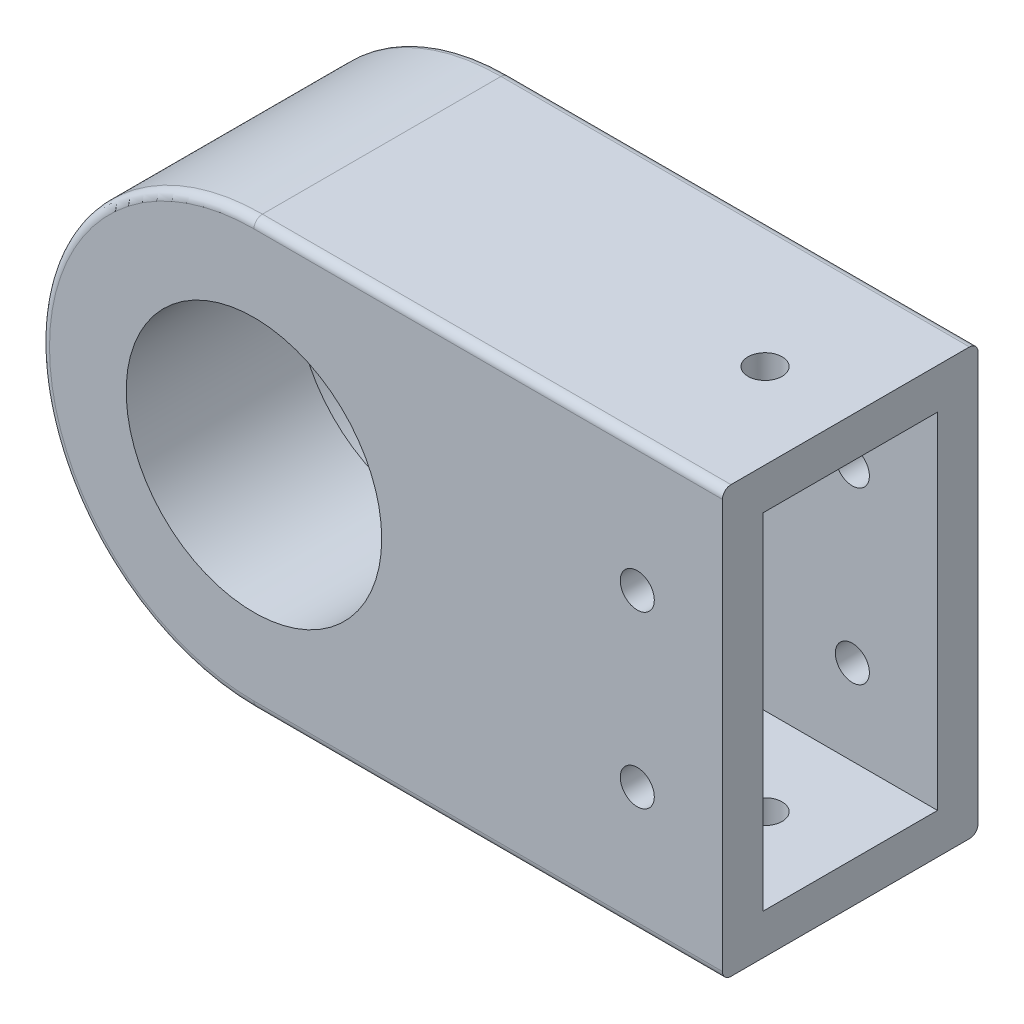
ISO-10303-21;
HEADER;
FILE_DESCRIPTION(('STEP AP214'),'2;1');
FILE_NAME('part.step','',(''),(''),'','','');
FILE_SCHEMA(('AUTOMOTIVE_DESIGN { 1 0 10303 214 1 1 1 1 }'));
ENDSEC;
DATA;
#1=APPLICATION_CONTEXT('core data for automotive mechanical design processes');
#2=APPLICATION_PROTOCOL_DEFINITION('international standard','automotive_design',2000,#1);
#3=PRODUCT_CONTEXT('',#1,'mechanical');
#4=PRODUCT('Part','Part','',(#3));
#5=PRODUCT_RELATED_PRODUCT_CATEGORY('part','',(#4));
#6=PRODUCT_DEFINITION_FORMATION('','',#4);
#7=PRODUCT_DEFINITION_CONTEXT('part definition',#1,'design');
#8=PRODUCT_DEFINITION('design','',#6,#7);
#9=PRODUCT_DEFINITION_SHAPE('','',#8);
#10=(LENGTH_UNIT() NAMED_UNIT(*) SI_UNIT(.MILLI.,.METRE.));
#11=(NAMED_UNIT(*) PLANE_ANGLE_UNIT() SI_UNIT($,.RADIAN.));
#12=(NAMED_UNIT(*) SI_UNIT($,.STERADIAN.) SOLID_ANGLE_UNIT());
#13=UNCERTAINTY_MEASURE_WITH_UNIT(LENGTH_MEASURE(1.E-05),#10,'distance_accuracy_value','');
#14=(GEOMETRIC_REPRESENTATION_CONTEXT(3) GLOBAL_UNCERTAINTY_ASSIGNED_CONTEXT((#13)) GLOBAL_UNIT_ASSIGNED_CONTEXT((#10,
#11,#12)) REPRESENTATION_CONTEXT('',''));
#15=CARTESIAN_POINT('',(0.,0.,0.));
#16=DIRECTION('',(0.,0.,1.));
#17=DIRECTION('',(1.,0.,0.));
#18=AXIS2_PLACEMENT_3D('',#15,#16,#17);
#19=CARTESIAN_POINT('',(0.,0.,5.));
#20=DIRECTION('',(0.,0.,1.));
#21=DIRECTION('',(1.,0.,0.));
#22=AXIS2_PLACEMENT_3D('',#19,#20,#21);
#23=CYLINDRICAL_SURFACE('',#22,19.25);
#24=CARTESIAN_POINT('',(0.,0.,5.));
#25=DIRECTION('',(0.,0.,1.));
#26=DIRECTION('',(1.,0.,0.));
#27=AXIS2_PLACEMENT_3D('',#24,#25,#26);
#28=CIRCLE('',#27,19.25);
#29=CARTESIAN_POINT('',(19.25,0.,5.));
#30=VERTEX_POINT('',#29);
#31=EDGE_CURVE('E141',#30,#30,#28,.T.);
#32=ORIENTED_EDGE('',*,*,#31,.F.);
#33=EDGE_LOOP('',(#32));
#34=FACE_BOUND('',#33,.T.);
#35=CARTESIAN_POINT('',(0.,0.,10.));
#36=DIRECTION('',(0.,0.,1.));
#37=DIRECTION('',(1.,0.,0.));
#38=AXIS2_PLACEMENT_3D('',#35,#36,#37);
#39=CIRCLE('',#38,19.25);
#40=CARTESIAN_POINT('',(19.25,0.,10.));
#41=VERTEX_POINT('',#40);
#42=EDGE_CURVE('E11',#41,#41,#39,.F.);
#43=ORIENTED_EDGE('',*,*,#42,.F.);
#44=EDGE_LOOP('',(#43));
#45=FACE_BOUND('',#44,.T.);
#46=ADVANCED_FACE('F31',(#34,#45),#23,.F.);
#47=CARTESIAN_POINT('',(70.,-25.,30.));
#48=DIRECTION('',(0.,1.,0.));
#49=DIRECTION('',(0.,0.,1.));
#50=AXIS2_PLACEMENT_3D('',#47,#48,#49);
#51=PLANE('',#50);
#52=DIRECTION('',(0.,0.,-1.));
#53=VECTOR('',#52,1.);
#54=CARTESIAN_POINT('',(55.,-25.,0.));
#55=LINE('',#54,#53);
#56=CARTESIAN_POINT('',(55.,-25.,29.));
#57=VERTEX_POINT('',#56);
#58=CARTESIAN_POINT('',(55.,-25.,1.));
#59=VERTEX_POINT('',#58);
#60=EDGE_CURVE('E239',#57,#59,#55,.T.);
#61=ORIENTED_EDGE('',*,*,#60,.F.);
#62=DIRECTION('',(1.,0.,0.));
#63=VECTOR('',#62,1.);
#64=CARTESIAN_POINT('',(0.,-25.,29.));
#65=LINE('',#64,#63);
#66=CARTESIAN_POINT('',(0.,-25.,29.));
#67=VERTEX_POINT('',#66);
#68=EDGE_CURVE('E39',#57,#67,#65,.F.);
#69=ORIENTED_EDGE('',*,*,#68,.T.);
#70=DIRECTION('',(0.,0.,-1.));
#71=VECTOR('',#70,1.);
#72=CARTESIAN_POINT('',(0.,-25.,30.));
#73=LINE('',#72,#71);
#74=CARTESIAN_POINT('',(0.,-25.,1.));
#75=VERTEX_POINT('',#74);
#76=EDGE_CURVE('E131',#67,#75,#73,.T.);
#77=ORIENTED_EDGE('',*,*,#76,.T.);
#78=DIRECTION('',(1.,0.,0.));
#79=VECTOR('',#78,1.);
#80=CARTESIAN_POINT('',(70.,-25.,1.));
#81=LINE('',#80,#79);
#82=EDGE_CURVE('E205',#75,#59,#81,.T.);
#83=ORIENTED_EDGE('',*,*,#82,.T.);
#84=EDGE_LOOP('',(#61,#69,#77,#83));
#85=FACE_BOUND('',#84,.T.);
#86=CARTESIAN_POINT('',(45.,-25.,15.));
#87=DIRECTION('',(0.,1.,0.));
#88=DIRECTION('',(0.,0.,1.));
#89=AXIS2_PLACEMENT_3D('',#86,#87,#88);
#90=CIRCLE('',#89,2.);
#91=CARTESIAN_POINT('',(45.,-25.,17.));
#92=VERTEX_POINT('',#91);
#93=EDGE_CURVE('E173',#92,#92,#90,.F.);
#94=ORIENTED_EDGE('',*,*,#93,.F.);
#95=EDGE_LOOP('',(#94));
#96=FACE_BOUND('',#95,.T.);
#97=ADVANCED_FACE('F278',(#85,#96),#51,.F.);
#98=CARTESIAN_POINT('',(0.,25.,30.));
#99=DIRECTION('',(0.,-1.,0.));
#100=DIRECTION('',(0.,0.,-1.));
#101=AXIS2_PLACEMENT_3D('',#98,#99,#100);
#102=PLANE('',#101);
#103=DIRECTION('',(0.,0.,1.));
#104=VECTOR('',#103,1.);
#105=CARTESIAN_POINT('',(55.,25.,30.));
#106=LINE('',#105,#104);
#107=CARTESIAN_POINT('',(55.,25.,1.));
#108=VERTEX_POINT('',#107);
#109=CARTESIAN_POINT('',(55.,25.,29.));
#110=VERTEX_POINT('',#109);
#111=EDGE_CURVE('E229',#108,#110,#106,.T.);
#112=ORIENTED_EDGE('',*,*,#111,.F.);
#113=DIRECTION('',(-1.,0.,0.));
#114=VECTOR('',#113,1.);
#115=CARTESIAN_POINT('',(0.,25.,1.));
#116=LINE('',#115,#114);
#117=CARTESIAN_POINT('',(0.,25.,1.));
#118=VERTEX_POINT('',#117);
#119=EDGE_CURVE('E180',#108,#118,#116,.T.);
#120=ORIENTED_EDGE('',*,*,#119,.T.);
#121=DIRECTION('',(0.,0.,-1.));
#122=VECTOR('',#121,1.);
#123=CARTESIAN_POINT('',(0.,25.,30.));
#124=LINE('',#123,#122);
#125=CARTESIAN_POINT('',(0.,25.,29.));
#126=VERTEX_POINT('',#125);
#127=EDGE_CURVE('E159',#126,#118,#124,.T.);
#128=ORIENTED_EDGE('',*,*,#127,.F.);
#129=DIRECTION('',(-1.,0.,0.));
#130=VECTOR('',#129,1.);
#131=CARTESIAN_POINT('',(55.,25.,29.));
#132=LINE('',#131,#130);
#133=EDGE_CURVE('E130',#126,#110,#132,.F.);
#134=ORIENTED_EDGE('',*,*,#133,.T.);
#135=EDGE_LOOP('',(#112,#120,#128,#134));
#136=FACE_BOUND('',#135,.T.);
#137=CARTESIAN_POINT('',(45.,25.,15.));
#138=DIRECTION('',(0.,-1.,0.));
#139=DIRECTION('',(0.,0.,-1.));
#140=AXIS2_PLACEMENT_3D('',#137,#138,#139);
#141=CIRCLE('',#140,2.);
#142=CARTESIAN_POINT('',(45.,25.,13.));
#143=VERTEX_POINT('',#142);
#144=EDGE_CURVE('E370',#143,#143,#141,.F.);
#145=ORIENTED_EDGE('',*,*,#144,.F.);
#146=EDGE_LOOP('',(#145));
#147=FACE_BOUND('',#146,.T.);
#148=ADVANCED_FACE('F227',(#136,#147),#102,.F.);
#149=CARTESIAN_POINT('',(20.,20.25,25.25));
#150=DIRECTION('',(0.,1.,0.));
#151=DIRECTION('',(0.,0.,1.));
#152=AXIS2_PLACEMENT_3D('',#149,#150,#151);
#153=PLANE('',#152);
#154=DIRECTION('',(1.,0.,0.));
#155=VECTOR('',#154,1.);
#156=CARTESIAN_POINT('',(20.,20.25,4.75000000000001));
#157=LINE('',#156,#155);
#158=CARTESIAN_POINT('',(20.,20.25,4.75000000000001));
#159=VERTEX_POINT('',#158);
#160=CARTESIAN_POINT('',(55.,20.25,4.75000000000001));
#161=VERTEX_POINT('',#160);
#162=EDGE_CURVE('E138',#159,#161,#157,.T.);
#163=ORIENTED_EDGE('',*,*,#162,.T.);
#164=DIRECTION('',(0.,0.,1.));
#165=VECTOR('',#164,1.);
#166=CARTESIAN_POINT('',(55.,20.25,25.25));
#167=LINE('',#166,#165);
#168=CARTESIAN_POINT('',(55.,20.25,25.25));
#169=VERTEX_POINT('',#168);
#170=EDGE_CURVE('E120',#161,#169,#167,.T.);
#171=ORIENTED_EDGE('',*,*,#170,.T.);
#172=DIRECTION('',(1.,0.,0.));
#173=VECTOR('',#172,1.);
#174=CARTESIAN_POINT('',(20.,20.25,25.25));
#175=LINE('',#174,#173);
#176=CARTESIAN_POINT('',(20.,20.25,25.25));
#177=VERTEX_POINT('',#176);
#178=EDGE_CURVE('E149',#177,#169,#175,.T.);
#179=ORIENTED_EDGE('',*,*,#178,.F.);
#180=DIRECTION('',(0.,0.,1.));
#181=VECTOR('',#180,1.);
#182=CARTESIAN_POINT('',(20.,20.25,25.25));
#183=LINE('',#182,#181);
#184=EDGE_CURVE('E147',#159,#177,#183,.T.);
#185=ORIENTED_EDGE('',*,*,#184,.F.);
#186=EDGE_LOOP('',(#163,#171,#179,#185));
#187=FACE_BOUND('',#186,.T.);
#188=CARTESIAN_POINT('',(45.,20.25,15.));
#189=DIRECTION('',(0.,1.,0.));
#190=DIRECTION('',(0.,0.,1.));
#191=AXIS2_PLACEMENT_3D('',#188,#189,#190);
#192=CIRCLE('',#191,2.);
#193=CARTESIAN_POINT('',(45.,20.25,17.));
#194=VERTEX_POINT('',#193);
#195=EDGE_CURVE('E177',#194,#194,#192,.F.);
#196=ORIENTED_EDGE('',*,*,#195,.F.);
#197=EDGE_LOOP('',(#196));
#198=FACE_BOUND('',#197,.T.);
#199=ADVANCED_FACE('F144',(#187,#198),#153,.F.);
#200=CARTESIAN_POINT('',(20.,-20.25,25.25));
#201=DIRECTION('',(0.,-1.,0.));
#202=DIRECTION('',(0.,0.,-1.));
#203=AXIS2_PLACEMENT_3D('',#200,#201,#202);
#204=PLANE('',#203);
#205=DIRECTION('',(1.,0.,0.));
#206=VECTOR('',#205,1.);
#207=CARTESIAN_POINT('',(20.,-20.25,25.25));
#208=LINE('',#207,#206);
#209=CARTESIAN_POINT('',(20.,-20.25,25.25));
#210=VERTEX_POINT('',#209);
#211=CARTESIAN_POINT('',(55.,-20.25,25.25));
#212=VERTEX_POINT('',#211);
#213=EDGE_CURVE('E152',#210,#212,#208,.T.);
#214=ORIENTED_EDGE('',*,*,#213,.T.);
#215=DIRECTION('',(0.,0.,-1.));
#216=VECTOR('',#215,1.);
#217=CARTESIAN_POINT('',(55.,-20.25,25.25));
#218=LINE('',#217,#216);
#219=CARTESIAN_POINT('',(55.,-20.25,4.75000000000001));
#220=VERTEX_POINT('',#219);
#221=EDGE_CURVE('E142',#212,#220,#218,.T.);
#222=ORIENTED_EDGE('',*,*,#221,.T.);
#223=DIRECTION('',(1.,0.,0.));
#224=VECTOR('',#223,1.);
#225=CARTESIAN_POINT('',(20.,-20.25,4.75000000000001));
#226=LINE('',#225,#224);
#227=CARTESIAN_POINT('',(20.,-20.25,4.75000000000001));
#228=VERTEX_POINT('',#227);
#229=EDGE_CURVE('E140',#228,#220,#226,.T.);
#230=ORIENTED_EDGE('',*,*,#229,.F.);
#231=DIRECTION('',(0.,0.,-1.));
#232=VECTOR('',#231,1.);
#233=CARTESIAN_POINT('',(20.,-20.25,25.25));
#234=LINE('',#233,#232);
#235=EDGE_CURVE('E150',#210,#228,#234,.T.);
#236=ORIENTED_EDGE('',*,*,#235,.F.);
#237=EDGE_LOOP('',(#214,#222,#230,#236));
#238=FACE_BOUND('',#237,.T.);
#239=CARTESIAN_POINT('',(45.,-20.25,15.));
#240=DIRECTION('',(0.,-1.,0.));
#241=DIRECTION('',(0.,0.,-1.));
#242=AXIS2_PLACEMENT_3D('',#239,#240,#241);
#243=CIRCLE('',#242,2.);
#244=CARTESIAN_POINT('',(45.,-20.25,13.));
#245=VERTEX_POINT('',#244);
#246=EDGE_CURVE('E174',#245,#245,#243,.F.);
#247=ORIENTED_EDGE('',*,*,#246,.F.);
#248=EDGE_LOOP('',(#247));
#249=FACE_BOUND('',#248,.T.);
#250=ADVANCED_FACE('F255',(#238,#249),#204,.F.);
#251=CARTESIAN_POINT('',(0.,0.,30.));
#252=DIRECTION('',(0.,0.,1.));
#253=DIRECTION('',(1.,0.,0.));
#254=AXIS2_PLACEMENT_3D('',#251,#252,#253);
#255=PLANE('',#254);
#256=CARTESIAN_POINT('',(45.,-10.25,30.));
#257=DIRECTION('',(0.,0.,1.));
#258=DIRECTION('',(1.,0.,0.));
#259=AXIS2_PLACEMENT_3D('',#256,#257,#258);
#260=CIRCLE('',#259,2.);
#261=CARTESIAN_POINT('',(47.,-10.25,30.));
#262=VERTEX_POINT('',#261);
#263=EDGE_CURVE('E387',#262,#262,#260,.F.);
#264=ORIENTED_EDGE('',*,*,#263,.T.);
#265=EDGE_LOOP('',(#264));
#266=FACE_BOUND('',#265,.T.);
#267=CARTESIAN_POINT('',(0.,0.,30.));
#268=DIRECTION('',(0.,0.,1.));
#269=DIRECTION('',(1.,0.,0.));
#270=AXIS2_PLACEMENT_3D('',#267,#268,#269);
#271=CIRCLE('',#270,24.);
#272=CARTESIAN_POINT('',(0.,24.,30.));
#273=VERTEX_POINT('',#272);
#274=CARTESIAN_POINT('',(0.,-24.,30.));
#275=VERTEX_POINT('',#274);
#276=EDGE_CURVE('E46',#273,#275,#271,.T.);
#277=ORIENTED_EDGE('',*,*,#276,.T.);
#278=DIRECTION('',(1.,0.,0.));
#279=VECTOR('',#278,1.);
#280=CARTESIAN_POINT('',(55.,-24.,30.));
#281=LINE('',#280,#279);
#282=CARTESIAN_POINT('',(55.,-24.,30.));
#283=VERTEX_POINT('',#282);
#284=EDGE_CURVE('E203',#275,#283,#281,.T.);
#285=ORIENTED_EDGE('',*,*,#284,.T.);
#286=DIRECTION('',(0.,-1.,0.));
#287=VECTOR('',#286,1.);
#288=CARTESIAN_POINT('',(55.,-25.,30.));
#289=LINE('',#288,#287);
#290=CARTESIAN_POINT('',(55.,24.,30.));
#291=VERTEX_POINT('',#290);
#292=EDGE_CURVE('E235',#291,#283,#289,.T.);
#293=ORIENTED_EDGE('',*,*,#292,.F.);
#294=DIRECTION('',(-1.,0.,0.));
#295=VECTOR('',#294,1.);
#296=CARTESIAN_POINT('',(0.,24.,30.));
#297=LINE('',#296,#295);
#298=EDGE_CURVE('E51',#291,#273,#297,.T.);
#299=ORIENTED_EDGE('',*,*,#298,.T.);
#300=EDGE_LOOP('',(#277,#285,#293,#299));
#301=FACE_BOUND('',#300,.T.);
#302=CARTESIAN_POINT('',(45.,9.75,30.));
#303=DIRECTION('',(0.,0.,1.));
#304=DIRECTION('',(1.,0.,0.));
#305=AXIS2_PLACEMENT_3D('',#302,#303,#304);
#306=CIRCLE('',#305,2.);
#307=CARTESIAN_POINT('',(47.,9.75,30.));
#308=VERTEX_POINT('',#307);
#309=EDGE_CURVE('E168',#308,#308,#306,.F.);
#310=ORIENTED_EDGE('',*,*,#309,.T.);
#311=EDGE_LOOP('',(#310));
#312=FACE_BOUND('',#311,.T.);
#313=CARTESIAN_POINT('',(0.,0.,30.));
#314=DIRECTION('',(0.,0.,1.));
#315=DIRECTION('',(1.,0.,0.));
#316=AXIS2_PLACEMENT_3D('',#313,#314,#315);
#317=CIRCLE('',#316,15.);
#318=CARTESIAN_POINT('',(15.,0.,30.));
#319=VERTEX_POINT('',#318);
#320=EDGE_CURVE('E334',#319,#319,#317,.T.);
#321=ORIENTED_EDGE('',*,*,#320,.F.);
#322=EDGE_LOOP('',(#321));
#323=FACE_BOUND('',#322,.T.);
#324=ADVANCED_FACE('F414',(#266,#301,#312,#323),#255,.T.);
#325=CARTESIAN_POINT('',(0.,0.,0.));
#326=DIRECTION('',(0.,0.,1.));
#327=DIRECTION('',(1.,0.,0.));
#328=AXIS2_PLACEMENT_3D('',#325,#326,#327);
#329=PLANE('',#328);
#330=CARTESIAN_POINT('',(0.,-8.,0.));
#331=DIRECTION('',(0.,0.,1.));
#332=DIRECTION('',(1.,0.,0.));
#333=AXIS2_PLACEMENT_3D('',#330,#331,#332);
#334=CIRCLE('',#333,1.);
#335=CARTESIAN_POINT('',(1.,-8.,0.));
#336=VERTEX_POINT('',#335);
#337=EDGE_CURVE('E340',#336,#336,#334,.T.);
#338=ORIENTED_EDGE('',*,*,#337,.T.);
#339=EDGE_LOOP('',(#338));
#340=FACE_BOUND('',#339,.T.);
#341=CARTESIAN_POINT('',(8.,0.,0.));
#342=DIRECTION('',(0.,0.,1.));
#343=DIRECTION('',(1.,0.,0.));
#344=AXIS2_PLACEMENT_3D('',#341,#342,#343);
#345=CIRCLE('',#344,1.);
#346=CARTESIAN_POINT('',(9.,0.,0.));
#347=VERTEX_POINT('',#346);
#348=EDGE_CURVE('E346',#347,#347,#345,.T.);
#349=ORIENTED_EDGE('',*,*,#348,.T.);
#350=EDGE_LOOP('',(#349));
#351=FACE_BOUND('',#350,.T.);
#352=CARTESIAN_POINT('',(0.,8.,0.));
#353=DIRECTION('',(0.,0.,1.));
#354=DIRECTION('',(1.,0.,0.));
#355=AXIS2_PLACEMENT_3D('',#352,#353,#354);
#356=CIRCLE('',#355,1.);
#357=CARTESIAN_POINT('',(1.,8.,0.));
#358=VERTEX_POINT('',#357);
#359=EDGE_CURVE('E352',#358,#358,#356,.T.);
#360=ORIENTED_EDGE('',*,*,#359,.T.);
#361=EDGE_LOOP('',(#360));
#362=FACE_BOUND('',#361,.T.);
#363=CARTESIAN_POINT('',(-8.,0.,0.));
#364=DIRECTION('',(0.,0.,1.));
#365=DIRECTION('',(1.,0.,0.));
#366=AXIS2_PLACEMENT_3D('',#363,#364,#365);
#367=CIRCLE('',#366,1.);
#368=CARTESIAN_POINT('',(-7.,0.,0.));
#369=VERTEX_POINT('',#368);
#370=EDGE_CURVE('E358',#369,#369,#367,.T.);
#371=ORIENTED_EDGE('',*,*,#370,.T.);
#372=EDGE_LOOP('',(#371));
#373=FACE_BOUND('',#372,.T.);
#374=CARTESIAN_POINT('',(45.,-10.25,0.));
#375=DIRECTION('',(0.,0.,1.));
#376=DIRECTION('',(1.,0.,0.));
#377=AXIS2_PLACEMENT_3D('',#374,#375,#376);
#378=CIRCLE('',#377,2.);
#379=CARTESIAN_POINT('',(47.,-10.25,0.));
#380=VERTEX_POINT('',#379);
#381=EDGE_CURVE('E384',#380,#380,#378,.F.);
#382=ORIENTED_EDGE('',*,*,#381,.F.);
#383=EDGE_LOOP('',(#382));
#384=FACE_BOUND('',#383,.T.);
#385=CARTESIAN_POINT('',(0.,0.,0.));
#386=DIRECTION('',(0.,0.,1.));
#387=DIRECTION('',(1.,0.,0.));
#388=AXIS2_PLACEMENT_3D('',#385,#386,#387);
#389=CIRCLE('',#388,24.);
#390=CARTESIAN_POINT('',(0.,-24.,0.));
#391=VERTEX_POINT('',#390);
#392=CARTESIAN_POINT('',(0.,24.,0.));
#393=VERTEX_POINT('',#392);
#394=EDGE_CURVE('E185',#391,#393,#389,.F.);
#395=ORIENTED_EDGE('',*,*,#394,.T.);
#396=DIRECTION('',(-1.,0.,0.));
#397=VECTOR('',#396,1.);
#398=CARTESIAN_POINT('',(0.,24.,0.));
#399=LINE('',#398,#397);
#400=CARTESIAN_POINT('',(55.,24.,0.));
#401=VERTEX_POINT('',#400);
#402=EDGE_CURVE('E187',#393,#401,#399,.F.);
#403=ORIENTED_EDGE('',*,*,#402,.T.);
#404=DIRECTION('',(0.,1.,0.));
#405=VECTOR('',#404,1.);
#406=CARTESIAN_POINT('',(55.,25.,0.));
#407=LINE('',#406,#405);
#408=CARTESIAN_POINT('',(55.,-24.,0.));
#409=VERTEX_POINT('',#408);
#410=EDGE_CURVE('E236',#409,#401,#407,.T.);
#411=ORIENTED_EDGE('',*,*,#410,.F.);
#412=DIRECTION('',(1.,0.,0.));
#413=VECTOR('',#412,1.);
#414=CARTESIAN_POINT('',(0.,-24.,0.));
#415=LINE('',#414,#413);
#416=EDGE_CURVE('E183',#409,#391,#415,.F.);
#417=ORIENTED_EDGE('',*,*,#416,.T.);
#418=EDGE_LOOP('',(#395,#403,#411,#417));
#419=FACE_BOUND('',#418,.T.);
#420=CARTESIAN_POINT('',(45.,9.75,0.));
#421=DIRECTION('',(0.,0.,1.));
#422=DIRECTION('',(1.,0.,0.));
#423=AXIS2_PLACEMENT_3D('',#420,#421,#422);
#424=CIRCLE('',#423,2.);
#425=CARTESIAN_POINT('',(47.,9.75,0.));
#426=VERTEX_POINT('',#425);
#427=EDGE_CURVE('E377',#426,#426,#424,.F.);
#428=ORIENTED_EDGE('',*,*,#427,.F.);
#429=EDGE_LOOP('',(#428));
#430=FACE_BOUND('',#429,.T.);
#431=CARTESIAN_POINT('',(0.,0.,0.));
#432=DIRECTION('',(0.,0.,1.));
#433=DIRECTION('',(1.,0.,0.));
#434=AXIS2_PLACEMENT_3D('',#431,#432,#433);
#435=CIRCLE('',#434,5.);
#436=CARTESIAN_POINT('',(5.,0.,0.));
#437=VERTEX_POINT('',#436);
#438=EDGE_CURVE('E215',#437,#437,#435,.T.);
#439=ORIENTED_EDGE('',*,*,#438,.T.);
#440=EDGE_LOOP('',(#439));
#441=FACE_BOUND('',#440,.T.);
#442=ADVANCED_FACE('F401',(#340,#351,#362,#373,#384,#419,#430,#441),#329,.F.);
#443=CARTESIAN_POINT('',(20.,-20.25,25.25));
#444=DIRECTION('',(0.,0.,1.));
#445=DIRECTION('',(1.,0.,0.));
#446=AXIS2_PLACEMENT_3D('',#443,#444,#445);
#447=PLANE('',#446);
#448=CARTESIAN_POINT('',(45.,-10.25,25.25));
#449=DIRECTION('',(0.,0.,1.));
#450=DIRECTION('',(1.,0.,0.));
#451=AXIS2_PLACEMENT_3D('',#448,#449,#450);
#452=CIRCLE('',#451,2.);
#453=CARTESIAN_POINT('',(47.,-10.25,25.25));
#454=VERTEX_POINT('',#453);
#455=EDGE_CURVE('E167',#454,#454,#452,.F.);
#456=ORIENTED_EDGE('',*,*,#455,.F.);
#457=EDGE_LOOP('',(#456));
#458=FACE_BOUND('',#457,.T.);
#459=ORIENTED_EDGE('',*,*,#178,.T.);
#460=DIRECTION('',(0.,-1.,0.));
#461=VECTOR('',#460,1.);
#462=CARTESIAN_POINT('',(55.,-20.25,25.25));
#463=LINE('',#462,#461);
#464=EDGE_CURVE('E126',#169,#212,#463,.T.);
#465=ORIENTED_EDGE('',*,*,#464,.T.);
#466=ORIENTED_EDGE('',*,*,#213,.F.);
#467=DIRECTION('',(0.,-1.,0.));
#468=VECTOR('',#467,1.);
#469=CARTESIAN_POINT('',(20.,-20.25,25.25));
#470=LINE('',#469,#468);
#471=EDGE_CURVE('E155',#177,#210,#470,.T.);
#472=ORIENTED_EDGE('',*,*,#471,.F.);
#473=EDGE_LOOP('',(#459,#465,#466,#472));
#474=FACE_BOUND('',#473,.T.);
#475=CARTESIAN_POINT('',(45.,9.75,25.25));
#476=DIRECTION('',(0.,0.,1.));
#477=DIRECTION('',(1.,0.,0.));
#478=AXIS2_PLACEMENT_3D('',#475,#476,#477);
#479=CIRCLE('',#478,2.);
#480=CARTESIAN_POINT('',(47.,9.75,25.25));
#481=VERTEX_POINT('',#480);
#482=EDGE_CURVE('E172',#481,#481,#479,.F.);
#483=ORIENTED_EDGE('',*,*,#482,.F.);
#484=EDGE_LOOP('',(#483));
#485=FACE_BOUND('',#484,.T.);
#486=ADVANCED_FACE('F259',(#458,#474,#485),#447,.F.);
#487=CARTESIAN_POINT('',(20.,-20.25,4.75000000000001));
#488=DIRECTION('',(0.,0.,-1.));
#489=DIRECTION('',(-1.,0.,0.));
#490=AXIS2_PLACEMENT_3D('',#487,#488,#489);
#491=PLANE('',#490);
#492=CARTESIAN_POINT('',(45.,-10.25,4.75));
#493=DIRECTION('',(0.,0.,-1.));
#494=DIRECTION('',(-1.,0.,0.));
#495=AXIS2_PLACEMENT_3D('',#492,#493,#494);
#496=CIRCLE('',#495,2.);
#497=CARTESIAN_POINT('',(43.,-10.25,4.75));
#498=VERTEX_POINT('',#497);
#499=EDGE_CURVE('E164',#498,#498,#496,.F.);
#500=ORIENTED_EDGE('',*,*,#499,.F.);
#501=EDGE_LOOP('',(#500));
#502=FACE_BOUND('',#501,.T.);
#503=ORIENTED_EDGE('',*,*,#229,.T.);
#504=DIRECTION('',(0.,1.,0.));
#505=VECTOR('',#504,1.);
#506=CARTESIAN_POINT('',(55.,-20.25,4.75000000000001));
#507=LINE('',#506,#505);
#508=EDGE_CURVE('E123',#220,#161,#507,.T.);
#509=ORIENTED_EDGE('',*,*,#508,.T.);
#510=ORIENTED_EDGE('',*,*,#162,.F.);
#511=DIRECTION('',(0.,1.,0.));
#512=VECTOR('',#511,1.);
#513=CARTESIAN_POINT('',(20.,-20.25,4.75000000000001));
#514=LINE('',#513,#512);
#515=EDGE_CURVE('E247',#228,#159,#514,.T.);
#516=ORIENTED_EDGE('',*,*,#515,.F.);
#517=EDGE_LOOP('',(#503,#509,#510,#516));
#518=FACE_BOUND('',#517,.T.);
#519=CARTESIAN_POINT('',(45.,9.75,4.75));
#520=DIRECTION('',(0.,0.,-1.));
#521=DIRECTION('',(-1.,0.,0.));
#522=AXIS2_PLACEMENT_3D('',#519,#520,#521);
#523=CIRCLE('',#522,2.);
#524=CARTESIAN_POINT('',(43.,9.75,4.75));
#525=VERTEX_POINT('',#524);
#526=EDGE_CURVE('E169',#525,#525,#523,.F.);
#527=ORIENTED_EDGE('',*,*,#526,.F.);
#528=EDGE_LOOP('',(#527));
#529=FACE_BOUND('',#528,.T.);
#530=ADVANCED_FACE('F135',(#502,#518,#529),#491,.F.);
#531=CARTESIAN_POINT('',(0.,0.,30.));
#532=DIRECTION('',(0.,0.,-1.));
#533=DIRECTION('',(-1.,0.,0.));
#534=AXIS2_PLACEMENT_3D('',#531,#532,#533);
#535=CYLINDRICAL_SURFACE('',#534,25.);
#536=ORIENTED_EDGE('',*,*,#127,.T.);
#537=CARTESIAN_POINT('',(0.,0.,1.));
#538=DIRECTION('',(0.,0.,1.));
#539=DIRECTION('',(1.,0.,0.));
#540=AXIS2_PLACEMENT_3D('',#537,#538,#539);
#541=CIRCLE('',#540,25.);
#542=EDGE_CURVE('E199',#118,#75,#541,.T.);
#543=ORIENTED_EDGE('',*,*,#542,.T.);
#544=ORIENTED_EDGE('',*,*,#76,.F.);
#545=CARTESIAN_POINT('',(0.,0.,29.));
#546=DIRECTION('',(0.,0.,1.));
#547=DIRECTION('',(1.,0.,0.));
#548=AXIS2_PLACEMENT_3D('',#545,#546,#547);
#549=CIRCLE('',#548,25.);
#550=EDGE_CURVE('E197',#67,#126,#549,.F.);
#551=ORIENTED_EDGE('',*,*,#550,.T.);
#552=EDGE_LOOP('',(#536,#543,#544,#551));
#553=FACE_BOUND('',#552,.T.);
#554=ADVANCED_FACE('F409',(#553),#535,.T.);
#555=CARTESIAN_POINT('',(0.,0.,5.));
#556=DIRECTION('',(0.,0.,1.));
#557=DIRECTION('',(1.,0.,0.));
#558=AXIS2_PLACEMENT_3D('',#555,#556,#557);
#559=PLANE('',#558);
#560=CARTESIAN_POINT('',(0.,-8.,5.));
#561=DIRECTION('',(0.,0.,1.));
#562=DIRECTION('',(1.,0.,0.));
#563=AXIS2_PLACEMENT_3D('',#560,#561,#562);
#564=CIRCLE('',#563,1.);
#565=CARTESIAN_POINT('',(1.,-8.,5.));
#566=VERTEX_POINT('',#565);
#567=EDGE_CURVE('E337',#566,#566,#564,.T.);
#568=ORIENTED_EDGE('',*,*,#567,.F.);
#569=EDGE_LOOP('',(#568));
#570=FACE_BOUND('',#569,.T.);
#571=CARTESIAN_POINT('',(8.,0.,5.));
#572=DIRECTION('',(0.,0.,1.));
#573=DIRECTION('',(1.,0.,0.));
#574=AXIS2_PLACEMENT_3D('',#571,#572,#573);
#575=CIRCLE('',#574,1.);
#576=CARTESIAN_POINT('',(9.,0.,5.));
#577=VERTEX_POINT('',#576);
#578=EDGE_CURVE('E343',#577,#577,#575,.T.);
#579=ORIENTED_EDGE('',*,*,#578,.F.);
#580=EDGE_LOOP('',(#579));
#581=FACE_BOUND('',#580,.T.);
#582=CARTESIAN_POINT('',(0.,8.,5.));
#583=DIRECTION('',(0.,0.,1.));
#584=DIRECTION('',(1.,0.,0.));
#585=AXIS2_PLACEMENT_3D('',#582,#583,#584);
#586=CIRCLE('',#585,1.);
#587=CARTESIAN_POINT('',(1.,8.,5.));
#588=VERTEX_POINT('',#587);
#589=EDGE_CURVE('E349',#588,#588,#586,.T.);
#590=ORIENTED_EDGE('',*,*,#589,.F.);
#591=EDGE_LOOP('',(#590));
#592=FACE_BOUND('',#591,.T.);
#593=CARTESIAN_POINT('',(-8.,0.,5.));
#594=DIRECTION('',(0.,0.,1.));
#595=DIRECTION('',(1.,0.,0.));
#596=AXIS2_PLACEMENT_3D('',#593,#594,#595);
#597=CIRCLE('',#596,1.);
#598=CARTESIAN_POINT('',(-7.,0.,5.));
#599=VERTEX_POINT('',#598);
#600=EDGE_CURVE('E355',#599,#599,#597,.T.);
#601=ORIENTED_EDGE('',*,*,#600,.F.);
#602=EDGE_LOOP('',(#601));
#603=FACE_BOUND('',#602,.T.);
#604=ORIENTED_EDGE('',*,*,#31,.T.);
#605=EDGE_LOOP('',(#604));
#606=FACE_BOUND('',#605,.T.);
#607=CARTESIAN_POINT('',(0.,0.,5.));
#608=DIRECTION('',(0.,0.,1.));
#609=DIRECTION('',(1.,0.,0.));
#610=AXIS2_PLACEMENT_3D('',#607,#608,#609);
#611=CIRCLE('',#610,5.);
#612=CARTESIAN_POINT('',(5.,0.,5.));
#613=VERTEX_POINT('',#612);
#614=EDGE_CURVE('E361',#613,#613,#611,.T.);
#615=ORIENTED_EDGE('',*,*,#614,.F.);
#616=EDGE_LOOP('',(#615));
#617=FACE_BOUND('',#616,.T.);
#618=ADVANCED_FACE('F273',(#570,#581,#592,#603,#606,#617),#559,.T.);
#619=CARTESIAN_POINT('',(55.,-25.,30.));
#620=DIRECTION('',(-1.,0.,0.));
#621=DIRECTION('',(0.,0.,1.));
#622=AXIS2_PLACEMENT_3D('',#619,#620,#621);
#623=PLANE('',#622);
#624=ORIENTED_EDGE('',*,*,#410,.T.);
#625=CARTESIAN_POINT('',(55.,24.,1.));
#626=DIRECTION('',(-1.,0.,0.));
#627=DIRECTION('',(0.,0.,1.));
#628=AXIS2_PLACEMENT_3D('',#625,#626,#627);
#629=CIRCLE('',#628,1.);
#630=EDGE_CURVE('E195',#401,#108,#629,.F.);
#631=ORIENTED_EDGE('',*,*,#630,.T.);
#632=ORIENTED_EDGE('',*,*,#111,.T.);
#633=CARTESIAN_POINT('',(55.,24.,29.));
#634=DIRECTION('',(-1.,0.,0.));
#635=DIRECTION('',(0.,0.,1.));
#636=AXIS2_PLACEMENT_3D('',#633,#634,#635);
#637=CIRCLE('',#636,1.);
#638=EDGE_CURVE('E189',#110,#291,#637,.F.);
#639=ORIENTED_EDGE('',*,*,#638,.T.);
#640=ORIENTED_EDGE('',*,*,#292,.T.);
#641=CARTESIAN_POINT('',(55.,-24.,29.));
#642=DIRECTION('',(-1.,0.,0.));
#643=DIRECTION('',(0.,0.,1.));
#644=AXIS2_PLACEMENT_3D('',#641,#642,#643);
#645=CIRCLE('',#644,1.);
#646=EDGE_CURVE('E193',#283,#57,#645,.F.);
#647=ORIENTED_EDGE('',*,*,#646,.T.);
#648=ORIENTED_EDGE('',*,*,#60,.T.);
#649=CARTESIAN_POINT('',(55.,-24.,1.));
#650=DIRECTION('',(-1.,0.,0.));
#651=DIRECTION('',(0.,0.,1.));
#652=AXIS2_PLACEMENT_3D('',#649,#650,#651);
#653=CIRCLE('',#652,1.);
#654=EDGE_CURVE('E191',#59,#409,#653,.F.);
#655=ORIENTED_EDGE('',*,*,#654,.T.);
#656=EDGE_LOOP('',(#624,#631,#632,#639,#640,#647,#648,#655));
#657=FACE_BOUND('',#656,.T.);
#658=ORIENTED_EDGE('',*,*,#221,.F.);
#659=ORIENTED_EDGE('',*,*,#464,.F.);
#660=ORIENTED_EDGE('',*,*,#170,.F.);
#661=ORIENTED_EDGE('',*,*,#508,.F.);
#662=EDGE_LOOP('',(#658,#659,#660,#661));
#663=FACE_BOUND('',#662,.T.);
#664=ADVANCED_FACE('F122',(#657,#663),#623,.F.);
#665=CARTESIAN_POINT('',(20.,20.25,4.75000000000001));
#666=DIRECTION('',(-1.,0.,0.));
#667=DIRECTION('',(0.,0.,1.));
#668=AXIS2_PLACEMENT_3D('',#665,#666,#667);
#669=PLANE('',#668);
#670=ORIENTED_EDGE('',*,*,#515,.T.);
#671=ORIENTED_EDGE('',*,*,#184,.T.);
#672=ORIENTED_EDGE('',*,*,#471,.T.);
#673=ORIENTED_EDGE('',*,*,#235,.T.);
#674=EDGE_LOOP('',(#670,#671,#672,#673));
#675=FACE_BOUND('',#674,.T.);
#676=ADVANCED_FACE('F262',(#675),#669,.F.);
#677=CARTESIAN_POINT('',(45.,-10.25,104.75));
#678=DIRECTION('',(0.,0.,-1.));
#679=DIRECTION('',(-1.,0.,0.));
#680=AXIS2_PLACEMENT_3D('',#677,#678,#679);
#681=CYLINDRICAL_SURFACE('',#680,2.);
#682=ORIENTED_EDGE('',*,*,#499,.T.);
#683=EDGE_LOOP('',(#682));
#684=FACE_BOUND('',#683,.T.);
#685=ORIENTED_EDGE('',*,*,#381,.T.);
#686=EDGE_LOOP('',(#685));
#687=FACE_BOUND('',#686,.T.);
#688=ADVANCED_FACE('F264',(#684,#687),#681,.F.);
#689=ORIENTED_EDGE('',*,*,#263,.F.);
#690=EDGE_LOOP('',(#689));
#691=FACE_BOUND('',#690,.T.);
#692=ORIENTED_EDGE('',*,*,#455,.T.);
#693=EDGE_LOOP('',(#692));
#694=FACE_BOUND('',#693,.T.);
#695=ADVANCED_FACE('F270',(#691,#694),#681,.F.);
#696=CARTESIAN_POINT('',(45.,9.75,104.75));
#697=DIRECTION('',(0.,0.,-1.));
#698=DIRECTION('',(-1.,0.,0.));
#699=AXIS2_PLACEMENT_3D('',#696,#697,#698);
#700=CYLINDRICAL_SURFACE('',#699,2.);
#701=ORIENTED_EDGE('',*,*,#526,.T.);
#702=EDGE_LOOP('',(#701));
#703=FACE_BOUND('',#702,.T.);
#704=ORIENTED_EDGE('',*,*,#427,.T.);
#705=EDGE_LOOP('',(#704));
#706=FACE_BOUND('',#705,.T.);
#707=ADVANCED_FACE('F288',(#703,#706),#700,.F.);
#708=ORIENTED_EDGE('',*,*,#309,.F.);
#709=EDGE_LOOP('',(#708));
#710=FACE_BOUND('',#709,.T.);
#711=ORIENTED_EDGE('',*,*,#482,.T.);
#712=EDGE_LOOP('',(#711));
#713=FACE_BOUND('',#712,.T.);
#714=ADVANCED_FACE('F291',(#710,#713),#700,.F.);
#715=CARTESIAN_POINT('',(45.,79.75,15.));
#716=DIRECTION('',(0.,-1.,0.));
#717=DIRECTION('',(0.,0.,-1.));
#718=AXIS2_PLACEMENT_3D('',#715,#716,#717);
#719=CYLINDRICAL_SURFACE('',#718,2.);
#720=ORIENTED_EDGE('',*,*,#246,.T.);
#721=EDGE_LOOP('',(#720));
#722=FACE_BOUND('',#721,.T.);
#723=ORIENTED_EDGE('',*,*,#93,.T.);
#724=EDGE_LOOP('',(#723));
#725=FACE_BOUND('',#724,.T.);
#726=ADVANCED_FACE('F293',(#722,#725),#719,.F.);
#727=ORIENTED_EDGE('',*,*,#195,.T.);
#728=EDGE_LOOP('',(#727));
#729=FACE_BOUND('',#728,.T.);
#730=ORIENTED_EDGE('',*,*,#144,.T.);
#731=EDGE_LOOP('',(#730));
#732=FACE_BOUND('',#731,.T.);
#733=ADVANCED_FACE('F296',(#729,#732),#719,.F.);
#734=CARTESIAN_POINT('',(70.,-24.,1.));
#735=DIRECTION('',(1.,0.,0.));
#736=DIRECTION('',(0.,0.,-1.));
#737=AXIS2_PLACEMENT_3D('',#734,#735,#736);
#738=CYLINDRICAL_SURFACE('',#737,1.);
#739=ORIENTED_EDGE('',*,*,#654,.F.);
#740=ORIENTED_EDGE('',*,*,#82,.F.);
#741=CARTESIAN_POINT('',(0.,-24.,1.));
#742=DIRECTION('',(-1.,0.,0.));
#743=DIRECTION('',(0.,0.,1.));
#744=AXIS2_PLACEMENT_3D('',#741,#742,#743);
#745=CIRCLE('',#744,1.);
#746=EDGE_CURVE('E178',#391,#75,#745,.T.);
#747=ORIENTED_EDGE('',*,*,#746,.F.);
#748=ORIENTED_EDGE('',*,*,#416,.F.);
#749=EDGE_LOOP('',(#739,#740,#747,#748));
#750=FACE_BOUND('',#749,.T.);
#751=ADVANCED_FACE('F397',(#750),#738,.T.);
#752=CARTESIAN_POINT('',(0.,0.,1.));
#753=DIRECTION('',(0.,0.,1.));
#754=DIRECTION('',(1.,0.,0.));
#755=AXIS2_PLACEMENT_3D('',#752,#753,#754);
#756=TOROIDAL_SURFACE('',#755,24.,1.);
#757=ORIENTED_EDGE('',*,*,#746,.T.);
#758=ORIENTED_EDGE('',*,*,#542,.F.);
#759=CARTESIAN_POINT('',(0.,24.,1.));
#760=DIRECTION('',(1.,0.,0.));
#761=DIRECTION('',(0.,0.,-1.));
#762=AXIS2_PLACEMENT_3D('',#759,#760,#761);
#763=CIRCLE('',#762,1.);
#764=EDGE_CURVE('E208',#393,#118,#763,.T.);
#765=ORIENTED_EDGE('',*,*,#764,.F.);
#766=ORIENTED_EDGE('',*,*,#394,.F.);
#767=EDGE_LOOP('',(#757,#758,#765,#766));
#768=FACE_BOUND('',#767,.T.);
#769=ADVANCED_FACE('F448',(#768),#756,.T.);
#770=CARTESIAN_POINT('',(0.,24.,1.));
#771=DIRECTION('',(-1.,0.,0.));
#772=DIRECTION('',(0.,0.,1.));
#773=AXIS2_PLACEMENT_3D('',#770,#771,#772);
#774=CYLINDRICAL_SURFACE('',#773,1.);
#775=ORIENTED_EDGE('',*,*,#630,.F.);
#776=ORIENTED_EDGE('',*,*,#402,.F.);
#777=ORIENTED_EDGE('',*,*,#764,.T.);
#778=ORIENTED_EDGE('',*,*,#119,.F.);
#779=EDGE_LOOP('',(#775,#776,#777,#778));
#780=FACE_BOUND('',#779,.T.);
#781=ADVANCED_FACE('F405',(#780),#774,.T.);
#782=CARTESIAN_POINT('',(0.,24.,29.));
#783=DIRECTION('',(1.,0.,0.));
#784=DIRECTION('',(0.,0.,-1.));
#785=AXIS2_PLACEMENT_3D('',#782,#783,#784);
#786=CYLINDRICAL_SURFACE('',#785,1.);
#787=ORIENTED_EDGE('',*,*,#638,.F.);
#788=ORIENTED_EDGE('',*,*,#133,.F.);
#789=CARTESIAN_POINT('',(0.,24.,29.));
#790=DIRECTION('',(-1.,0.,0.));
#791=DIRECTION('',(0.,0.,1.));
#792=AXIS2_PLACEMENT_3D('',#789,#790,#791);
#793=CIRCLE('',#792,1.);
#794=EDGE_CURVE('E210',#273,#126,#793,.T.);
#795=ORIENTED_EDGE('',*,*,#794,.F.);
#796=ORIENTED_EDGE('',*,*,#298,.F.);
#797=EDGE_LOOP('',(#787,#788,#795,#796));
#798=FACE_BOUND('',#797,.T.);
#799=ADVANCED_FACE('F33',(#798),#786,.T.);
#800=CARTESIAN_POINT('',(0.,0.,29.));
#801=DIRECTION('',(0.,0.,1.));
#802=DIRECTION('',(1.,0.,0.));
#803=AXIS2_PLACEMENT_3D('',#800,#801,#802);
#804=TOROIDAL_SURFACE('',#803,24.,1.);
#805=ORIENTED_EDGE('',*,*,#794,.T.);
#806=ORIENTED_EDGE('',*,*,#550,.F.);
#807=CARTESIAN_POINT('',(0.,-24.,29.));
#808=DIRECTION('',(1.,0.,0.));
#809=DIRECTION('',(0.,0.,-1.));
#810=AXIS2_PLACEMENT_3D('',#807,#808,#809);
#811=CIRCLE('',#810,1.);
#812=EDGE_CURVE('E213',#275,#67,#811,.T.);
#813=ORIENTED_EDGE('',*,*,#812,.F.);
#814=ORIENTED_EDGE('',*,*,#276,.F.);
#815=EDGE_LOOP('',(#805,#806,#813,#814));
#816=FACE_BOUND('',#815,.T.);
#817=ADVANCED_FACE('F219',(#816),#804,.T.);
#818=CARTESIAN_POINT('',(0.,-24.,29.));
#819=DIRECTION('',(-1.,0.,0.));
#820=DIRECTION('',(0.,0.,1.));
#821=AXIS2_PLACEMENT_3D('',#818,#819,#820);
#822=CYLINDRICAL_SURFACE('',#821,1.);
#823=ORIENTED_EDGE('',*,*,#812,.T.);
#824=ORIENTED_EDGE('',*,*,#68,.F.);
#825=ORIENTED_EDGE('',*,*,#646,.F.);
#826=ORIENTED_EDGE('',*,*,#284,.F.);
#827=EDGE_LOOP('',(#823,#824,#825,#826));
#828=FACE_BOUND('',#827,.T.);
#829=ADVANCED_FACE('F302',(#828),#822,.T.);
#830=CARTESIAN_POINT('',(0.,0.,0.));
#831=DIRECTION('',(0.,0.,1.));
#832=DIRECTION('',(1.,0.,0.));
#833=AXIS2_PLACEMENT_3D('',#830,#831,#832);
#834=CYLINDRICAL_SURFACE('',#833,5.);
#835=ORIENTED_EDGE('',*,*,#438,.F.);
#836=EDGE_LOOP('',(#835));
#837=FACE_BOUND('',#836,.T.);
#838=ORIENTED_EDGE('',*,*,#614,.T.);
#839=EDGE_LOOP('',(#838));
#840=FACE_BOUND('',#839,.T.);
#841=ADVANCED_FACE('F298',(#837,#840),#834,.F.);
#842=CARTESIAN_POINT('',(-8.,0.,0.));
#843=DIRECTION('',(0.,0.,1.));
#844=DIRECTION('',(1.,0.,0.));
#845=AXIS2_PLACEMENT_3D('',#842,#843,#844);
#846=CYLINDRICAL_SURFACE('',#845,1.);
#847=ORIENTED_EDGE('',*,*,#370,.F.);
#848=EDGE_LOOP('',(#847));
#849=FACE_BOUND('',#848,.T.);
#850=ORIENTED_EDGE('',*,*,#600,.T.);
#851=EDGE_LOOP('',(#850));
#852=FACE_BOUND('',#851,.T.);
#853=ADVANCED_FACE('F301',(#849,#852),#846,.F.);
#854=CARTESIAN_POINT('',(0.,8.,0.));
#855=DIRECTION('',(0.,0.,1.));
#856=DIRECTION('',(1.,0.,0.));
#857=AXIS2_PLACEMENT_3D('',#854,#855,#856);
#858=CYLINDRICAL_SURFACE('',#857,1.);
#859=ORIENTED_EDGE('',*,*,#359,.F.);
#860=EDGE_LOOP('',(#859));
#861=FACE_BOUND('',#860,.T.);
#862=ORIENTED_EDGE('',*,*,#589,.T.);
#863=EDGE_LOOP('',(#862));
#864=FACE_BOUND('',#863,.T.);
#865=ADVANCED_FACE('F306',(#861,#864),#858,.F.);
#866=CARTESIAN_POINT('',(8.,0.,0.));
#867=DIRECTION('',(0.,0.,1.));
#868=DIRECTION('',(1.,0.,0.));
#869=AXIS2_PLACEMENT_3D('',#866,#867,#868);
#870=CYLINDRICAL_SURFACE('',#869,1.);
#871=ORIENTED_EDGE('',*,*,#348,.F.);
#872=EDGE_LOOP('',(#871));
#873=FACE_BOUND('',#872,.T.);
#874=ORIENTED_EDGE('',*,*,#578,.T.);
#875=EDGE_LOOP('',(#874));
#876=FACE_BOUND('',#875,.T.);
#877=ADVANCED_FACE('F310',(#873,#876),#870,.F.);
#878=CARTESIAN_POINT('',(0.,-8.,0.));
#879=DIRECTION('',(0.,0.,1.));
#880=DIRECTION('',(1.,0.,0.));
#881=AXIS2_PLACEMENT_3D('',#878,#879,#880);
#882=CYLINDRICAL_SURFACE('',#881,1.);
#883=ORIENTED_EDGE('',*,*,#337,.F.);
#884=EDGE_LOOP('',(#883));
#885=FACE_BOUND('',#884,.T.);
#886=ORIENTED_EDGE('',*,*,#567,.T.);
#887=EDGE_LOOP('',(#886));
#888=FACE_BOUND('',#887,.T.);
#889=ADVANCED_FACE('F314',(#885,#888),#882,.F.);
#890=CARTESIAN_POINT('',(0.,0.,10.));
#891=DIRECTION('',(0.,0.,1.));
#892=DIRECTION('',(1.,0.,0.));
#893=AXIS2_PLACEMENT_3D('',#890,#891,#892);
#894=PLANE('',#893);
#895=CARTESIAN_POINT('',(0.,0.,10.));
#896=DIRECTION('',(0.,0.,1.));
#897=DIRECTION('',(1.,0.,0.));
#898=AXIS2_PLACEMENT_3D('',#895,#896,#897);
#899=CIRCLE('',#898,15.);
#900=CARTESIAN_POINT('',(15.,0.,10.));
#901=VERTEX_POINT('',#900);
#902=EDGE_CURVE('E331',#901,#901,#899,.T.);
#903=ORIENTED_EDGE('',*,*,#902,.T.);
#904=EDGE_LOOP('',(#903));
#905=FACE_BOUND('',#904,.T.);
#906=ORIENTED_EDGE('',*,*,#42,.T.);
#907=EDGE_LOOP('',(#906));
#908=FACE_BOUND('',#907,.T.);
#909=ADVANCED_FACE('F318',(#905,#908),#894,.F.);
#910=CARTESIAN_POINT('',(0.,0.,10.));
#911=DIRECTION('',(0.,0.,1.));
#912=DIRECTION('',(1.,0.,0.));
#913=AXIS2_PLACEMENT_3D('',#910,#911,#912);
#914=CYLINDRICAL_SURFACE('',#913,15.);
#915=ORIENTED_EDGE('',*,*,#902,.F.);
#916=EDGE_LOOP('',(#915));
#917=FACE_BOUND('',#916,.T.);
#918=ORIENTED_EDGE('',*,*,#320,.T.);
#919=EDGE_LOOP('',(#918));
#920=FACE_BOUND('',#919,.T.);
#921=ADVANCED_FACE('F322',(#917,#920),#914,.F.);
#922=CLOSED_SHELL('',(#46,#97,#148,#199,#250,#324,#442,#486,#530,#554,#618,#664,#676,#688,#695,
#707,#714,#726,#733,#751,#769,#781,#799,#817,#829,#841,#853,#865,#877,#889,#909,#921));
#923=MANIFOLD_SOLID_BREP('B2',#922);
#924=ADVANCED_BREP_SHAPE_REPRESENTATION('',(#18,#923),#14);
#925=SHAPE_DEFINITION_REPRESENTATION(#9,#924);
ENDSEC;
END-ISO-10303-21;
